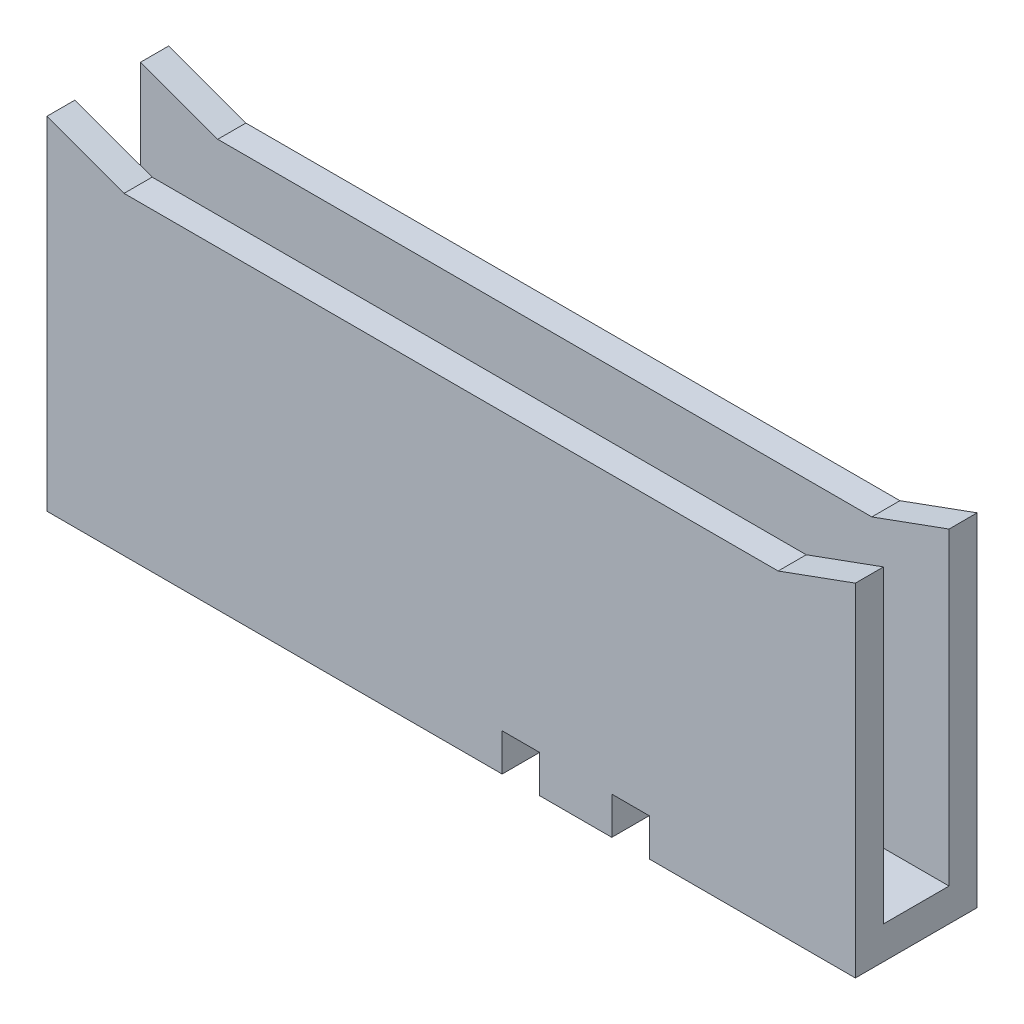
ISO-10303-21;
HEADER;
FILE_DESCRIPTION(('STEP AP214'),'2;1');
FILE_NAME('part.step','',(''),(''),'','','');
FILE_SCHEMA(('AUTOMOTIVE_DESIGN { 1 0 10303 214 1 1 1 1 }'));
ENDSEC;
DATA;
#1=APPLICATION_CONTEXT('core data for automotive mechanical design processes');
#2=APPLICATION_PROTOCOL_DEFINITION('international standard','automotive_design',2000,#1);
#3=PRODUCT_CONTEXT('',#1,'mechanical');
#4=PRODUCT('Part','Part','',(#3));
#5=PRODUCT_RELATED_PRODUCT_CATEGORY('part','',(#4));
#6=PRODUCT_DEFINITION_FORMATION('','',#4);
#7=PRODUCT_DEFINITION_CONTEXT('part definition',#1,'design');
#8=PRODUCT_DEFINITION('design','',#6,#7);
#9=PRODUCT_DEFINITION_SHAPE('','',#8);
#10=(LENGTH_UNIT() NAMED_UNIT(*) SI_UNIT(.MILLI.,.METRE.));
#11=(NAMED_UNIT(*) PLANE_ANGLE_UNIT() SI_UNIT($,.RADIAN.));
#12=(NAMED_UNIT(*) SI_UNIT($,.STERADIAN.) SOLID_ANGLE_UNIT());
#13=UNCERTAINTY_MEASURE_WITH_UNIT(LENGTH_MEASURE(1.E-05),#10,'distance_accuracy_value','');
#14=(GEOMETRIC_REPRESENTATION_CONTEXT(3) GLOBAL_UNCERTAINTY_ASSIGNED_CONTEXT((#13)) GLOBAL_UNIT_ASSIGNED_CONTEXT((#10,
#11,#12)) REPRESENTATION_CONTEXT('',''));
#15=CARTESIAN_POINT('',(0.,0.,0.));
#16=DIRECTION('',(0.,0.,1.));
#17=DIRECTION('',(1.,0.,0.));
#18=AXIS2_PLACEMENT_3D('',#15,#16,#17);
#19=CARTESIAN_POINT('',(43.15,-16.75,13.));
#20=DIRECTION('',(0.,1.,0.));
#21=DIRECTION('',(-1.,0.,0.));
#22=AXIS2_PLACEMENT_3D('',#19,#20,#21);
#23=PLANE('',#22);
#24=DIRECTION('',(1.,0.,0.));
#25=VECTOR('',#24,1.);
#26=CARTESIAN_POINT('',(43.15,-16.75,13.));
#27=LINE('',#26,#25);
#28=CARTESIAN_POINT('',(9.45,-16.75,13.));
#29=VERTEX_POINT('',#28);
#30=CARTESIAN_POINT('',(17.15,-16.75,13.));
#31=VERTEX_POINT('',#30);
#32=EDGE_CURVE('E389',#29,#31,#27,.T.);
#33=ORIENTED_EDGE('',*,*,#32,.F.);
#34=DIRECTION('',(0.,0.,1.));
#35=VECTOR('',#34,1.);
#36=CARTESIAN_POINT('',(9.45,-16.75,0.));
#37=LINE('',#36,#35);
#38=CARTESIAN_POINT('',(9.45,-16.75,0.));
#39=VERTEX_POINT('',#38);
#40=EDGE_CURVE('E253',#39,#29,#37,.T.);
#41=ORIENTED_EDGE('',*,*,#40,.F.);
#42=DIRECTION('',(1.,0.,0.));
#43=VECTOR('',#42,1.);
#44=CARTESIAN_POINT('',(43.15,-16.75,0.));
#45=LINE('',#44,#43);
#46=CARTESIAN_POINT('',(17.15,-16.75,0.));
#47=VERTEX_POINT('',#46);
#48=EDGE_CURVE('E240',#39,#47,#45,.T.);
#49=ORIENTED_EDGE('',*,*,#48,.T.);
#50=DIRECTION('',(0.,0.,1.));
#51=VECTOR('',#50,1.);
#52=CARTESIAN_POINT('',(17.15,-16.75,0.));
#53=LINE('',#52,#51);
#54=EDGE_CURVE('E267',#47,#31,#53,.T.);
#55=ORIENTED_EDGE('',*,*,#54,.T.);
#56=EDGE_LOOP('',(#33,#41,#49,#55));
#57=FACE_BOUND('',#56,.T.);
#58=ADVANCED_FACE('F32',(#57),#23,.F.);
#59=CARTESIAN_POINT('',(-38.15,-16.75,6.49999999999999));
#60=DIRECTION('',(0.,-1.,0.));
#61=DIRECTION('',(1.,0.,0.));
#62=AXIS2_PLACEMENT_3D('',#59,#60,#61);
#63=CIRCLE('',#62,0.974999999999999);
#64=CARTESIAN_POINT('',(-37.175,-16.75,6.49999999999999));
#65=VERTEX_POINT('',#64);
#66=EDGE_CURVE('E304',#65,#65,#63,.T.);
#67=ORIENTED_EDGE('',*,*,#66,.F.);
#68=EDGE_LOOP('',(#67));
#69=FACE_BOUND('',#68,.T.);
#70=CARTESIAN_POINT('',(-43.15,-16.75,0.));
#71=VERTEX_POINT('',#70);
#72=CARTESIAN_POINT('',(5.45,-16.75,0.));
#73=VERTEX_POINT('',#72);
#74=EDGE_CURVE('E398',#71,#73,#45,.T.);
#75=ORIENTED_EDGE('',*,*,#74,.T.);
#76=DIRECTION('',(0.,0.,1.));
#77=VECTOR('',#76,1.);
#78=CARTESIAN_POINT('',(5.45,-16.75,0.));
#79=LINE('',#78,#77);
#80=CARTESIAN_POINT('',(5.45,-16.75,13.));
#81=VERTEX_POINT('',#80);
#82=EDGE_CURVE('E256',#73,#81,#79,.T.);
#83=ORIENTED_EDGE('',*,*,#82,.T.);
#84=CARTESIAN_POINT('',(-43.15,-16.75,13.));
#85=VERTEX_POINT('',#84);
#86=EDGE_CURVE('E385',#85,#81,#27,.T.);
#87=ORIENTED_EDGE('',*,*,#86,.F.);
#88=DIRECTION('',(0.,0.,-1.));
#89=VECTOR('',#88,1.);
#90=CARTESIAN_POINT('',(-43.15,-16.75,13.));
#91=LINE('',#90,#89);
#92=EDGE_CURVE('E408',#85,#71,#91,.T.);
#93=ORIENTED_EDGE('',*,*,#92,.T.);
#94=EDGE_LOOP('',(#75,#83,#87,#93));
#95=FACE_BOUND('',#94,.T.);
#96=ADVANCED_FACE('F466',(#69,#95),#23,.F.);
#97=CARTESIAN_POINT('',(0.,-13.25,0.));
#98=DIRECTION('',(0.,1.,0.));
#99=DIRECTION('',(-1.,0.,0.));
#100=AXIS2_PLACEMENT_3D('',#97,#98,#99);
#101=PLANE('',#100);
#102=DIRECTION('',(0.,0.,-1.));
#103=VECTOR('',#102,1.);
#104=CARTESIAN_POINT('',(9.45,-13.25,0.));
#105=LINE('',#104,#103);
#106=CARTESIAN_POINT('',(9.45,-13.25,9.99999999999999));
#107=VERTEX_POINT('',#106);
#108=CARTESIAN_POINT('',(9.45,-13.25,3.00000000000001));
#109=VERTEX_POINT('',#108);
#110=EDGE_CURVE('E421',#107,#109,#105,.T.);
#111=ORIENTED_EDGE('',*,*,#110,.F.);
#112=DIRECTION('',(1.,0.,0.));
#113=VECTOR('',#112,1.);
#114=CARTESIAN_POINT('',(43.1499999999999,-13.25,9.99999999999999));
#115=LINE('',#114,#113);
#116=CARTESIAN_POINT('',(17.15,-13.25,9.99999999999999));
#117=VERTEX_POINT('',#116);
#118=EDGE_CURVE('E319',#107,#117,#115,.T.);
#119=ORIENTED_EDGE('',*,*,#118,.T.);
#120=DIRECTION('',(0.,0.,1.));
#121=VECTOR('',#120,1.);
#122=CARTESIAN_POINT('',(17.15,-13.25,0.));
#123=LINE('',#122,#121);
#124=CARTESIAN_POINT('',(17.15,-13.25,3.00000000000001));
#125=VERTEX_POINT('',#124);
#126=EDGE_CURVE('E417',#125,#117,#123,.T.);
#127=ORIENTED_EDGE('',*,*,#126,.F.);
#128=DIRECTION('',(-1.,0.,0.));
#129=VECTOR('',#128,1.);
#130=CARTESIAN_POINT('',(43.1499999999999,-13.25,3.00000000000001));
#131=LINE('',#130,#129);
#132=EDGE_CURVE('E327',#125,#109,#131,.T.);
#133=ORIENTED_EDGE('',*,*,#132,.T.);
#134=EDGE_LOOP('',(#111,#119,#127,#133));
#135=FACE_BOUND('',#134,.T.);
#136=ADVANCED_FACE('F534',(#135),#101,.T.);
#137=DIRECTION('',(0.,0.,1.));
#138=VECTOR('',#137,1.);
#139=CARTESIAN_POINT('',(5.45,-13.25,0.));
#140=LINE('',#139,#138);
#141=CARTESIAN_POINT('',(5.45,-13.25,3.00000000000001));
#142=VERTEX_POINT('',#141);
#143=CARTESIAN_POINT('',(5.45,-13.25,9.99999999999999));
#144=VERTEX_POINT('',#143);
#145=EDGE_CURVE('E419',#142,#144,#140,.T.);
#146=ORIENTED_EDGE('',*,*,#145,.F.);
#147=CARTESIAN_POINT('',(-43.15,-13.25,3.00000000000001));
#148=VERTEX_POINT('',#147);
#149=EDGE_CURVE('E322',#142,#148,#131,.T.);
#150=ORIENTED_EDGE('',*,*,#149,.T.);
#151=DIRECTION('',(0.,0.,1.));
#152=VECTOR('',#151,1.);
#153=CARTESIAN_POINT('',(-43.15,-13.25,9.99999999999999));
#154=LINE('',#153,#152);
#155=CARTESIAN_POINT('',(-43.15,-13.25,9.99999999999999));
#156=VERTEX_POINT('',#155);
#157=EDGE_CURVE('E310',#148,#156,#154,.T.);
#158=ORIENTED_EDGE('',*,*,#157,.T.);
#159=EDGE_CURVE('E315',#156,#144,#115,.T.);
#160=ORIENTED_EDGE('',*,*,#159,.T.);
#161=EDGE_LOOP('',(#146,#150,#158,#160));
#162=FACE_BOUND('',#161,.T.);
#163=CARTESIAN_POINT('',(-38.15,-13.25,6.49999999999999));
#164=DIRECTION('',(0.,1.,0.));
#165=DIRECTION('',(-1.,0.,0.));
#166=AXIS2_PLACEMENT_3D('',#163,#164,#165);
#167=CIRCLE('',#166,0.974999999999999);
#168=CARTESIAN_POINT('',(-39.125,-13.25,6.49999999999999));
#169=VERTEX_POINT('',#168);
#170=EDGE_CURVE('E330',#169,#169,#167,.T.);
#171=ORIENTED_EDGE('',*,*,#170,.F.);
#172=EDGE_LOOP('',(#171));
#173=FACE_BOUND('',#172,.T.);
#174=ADVANCED_FACE('F439',(#162,#173),#101,.T.);
#175=CARTESIAN_POINT('',(43.15,16.75,13.));
#176=DIRECTION('',(0.,-1.,0.));
#177=DIRECTION('',(1.,0.,0.));
#178=AXIS2_PLACEMENT_3D('',#175,#176,#177);
#179=PLANE('',#178);
#180=DIRECTION('',(0.,0.,-1.));
#181=VECTOR('',#180,1.);
#182=CARTESIAN_POINT('',(-34.9075677416363,16.75,13.));
#183=LINE('',#182,#181);
#184=CARTESIAN_POINT('',(-34.9075677416363,16.75,3.00000000000001));
#185=VERTEX_POINT('',#184);
#186=CARTESIAN_POINT('',(-34.9075677416363,16.75,0.));
#187=VERTEX_POINT('',#186);
#188=EDGE_CURVE('E362',#185,#187,#183,.T.);
#189=ORIENTED_EDGE('',*,*,#188,.F.);
#190=DIRECTION('',(-1.,0.,0.));
#191=VECTOR('',#190,1.);
#192=CARTESIAN_POINT('',(43.1499999999999,16.75,3.00000000000001));
#193=LINE('',#192,#191);
#194=CARTESIAN_POINT('',(34.9075677416361,16.75,3.00000000000001));
#195=VERTEX_POINT('',#194);
#196=EDGE_CURVE('E314',#195,#185,#193,.T.);
#197=ORIENTED_EDGE('',*,*,#196,.F.);
#198=DIRECTION('',(0.,0.,-1.));
#199=VECTOR('',#198,1.);
#200=CARTESIAN_POINT('',(34.9075677416361,16.75,13.));
#201=LINE('',#200,#199);
#202=CARTESIAN_POINT('',(34.9075677416361,16.75,0.));
#203=VERTEX_POINT('',#202);
#204=EDGE_CURVE('E369',#195,#203,#201,.T.);
#205=ORIENTED_EDGE('',*,*,#204,.T.);
#206=DIRECTION('',(-1.,0.,0.));
#207=VECTOR('',#206,1.);
#208=CARTESIAN_POINT('',(43.15,16.75,0.));
#209=LINE('',#208,#207);
#210=EDGE_CURVE('E384',#203,#187,#209,.T.);
#211=ORIENTED_EDGE('',*,*,#210,.T.);
#212=EDGE_LOOP('',(#189,#197,#205,#211));
#213=FACE_BOUND('',#212,.T.);
#214=ADVANCED_FACE('F475',(#213),#179,.F.);
#215=CARTESIAN_POINT('',(-43.15,-16.75,13.));
#216=DIRECTION('',(1.,0.,0.));
#217=DIRECTION('',(0.,0.,-1.));
#218=AXIS2_PLACEMENT_3D('',#215,#216,#217);
#219=PLANE('',#218);
#220=ORIENTED_EDGE('',*,*,#157,.F.);
#221=DIRECTION('',(0.,-1.,0.));
#222=VECTOR('',#221,1.);
#223=CARTESIAN_POINT('',(-43.15,19.751,3.00000000000001));
#224=LINE('',#223,#222);
#225=CARTESIAN_POINT('',(-43.15,19.75,3.00000000000001));
#226=VERTEX_POINT('',#225);
#227=EDGE_CURVE('E340',#226,#148,#224,.T.);
#228=ORIENTED_EDGE('',*,*,#227,.F.);
#229=DIRECTION('',(0.,0.,-1.));
#230=VECTOR('',#229,1.);
#231=CARTESIAN_POINT('',(-43.15,19.75,13.));
#232=LINE('',#231,#230);
#233=CARTESIAN_POINT('',(-43.15,19.75,0.));
#234=VERTEX_POINT('',#233);
#235=EDGE_CURVE('E355',#226,#234,#232,.T.);
#236=ORIENTED_EDGE('',*,*,#235,.T.);
#237=DIRECTION('',(0.,-1.,0.));
#238=VECTOR('',#237,1.);
#239=CARTESIAN_POINT('',(-43.15,-16.75,0.));
#240=LINE('',#239,#238);
#241=EDGE_CURVE('E375',#234,#71,#240,.T.);
#242=ORIENTED_EDGE('',*,*,#241,.T.);
#243=ORIENTED_EDGE('',*,*,#92,.F.);
#244=DIRECTION('',(0.,-1.,0.));
#245=VECTOR('',#244,1.);
#246=CARTESIAN_POINT('',(-43.15,-16.75,13.));
#247=LINE('',#246,#245);
#248=CARTESIAN_POINT('',(-43.15,19.75,13.));
#249=VERTEX_POINT('',#248);
#250=EDGE_CURVE('E380',#249,#85,#247,.T.);
#251=ORIENTED_EDGE('',*,*,#250,.F.);
#252=CARTESIAN_POINT('',(-43.15,19.75,10.));
#253=VERTEX_POINT('',#252);
#254=EDGE_CURVE('E363',#249,#253,#232,.T.);
#255=ORIENTED_EDGE('',*,*,#254,.T.);
#256=DIRECTION('',(0.,-1.,0.));
#257=VECTOR('',#256,1.);
#258=CARTESIAN_POINT('',(-43.15,19.751,10.));
#259=LINE('',#258,#257);
#260=EDGE_CURVE('E338',#253,#156,#259,.T.);
#261=ORIENTED_EDGE('',*,*,#260,.T.);
#262=EDGE_LOOP('',(#220,#228,#236,#242,#243,#251,#255,#261));
#263=FACE_BOUND('',#262,.T.);
#264=ADVANCED_FACE('F34',(#263),#219,.F.);
#265=CARTESIAN_POINT('',(43.15,-16.75,13.));
#266=DIRECTION('',(-1.,0.,0.));
#267=DIRECTION('',(0.,0.,1.));
#268=AXIS2_PLACEMENT_3D('',#265,#266,#267);
#269=PLANE('',#268);
#270=DIRECTION('',(0.,-1.,0.));
#271=VECTOR('',#270,1.);
#272=CARTESIAN_POINT('',(43.15,19.751,3.00000000000001));
#273=LINE('',#272,#271);
#274=CARTESIAN_POINT('',(43.15,19.75,3.00000000000001));
#275=VERTEX_POINT('',#274);
#276=CARTESIAN_POINT('',(43.1499999999999,-13.25,3.00000000000001));
#277=VERTEX_POINT('',#276);
#278=EDGE_CURVE('E326',#275,#277,#273,.T.);
#279=ORIENTED_EDGE('',*,*,#278,.T.);
#280=DIRECTION('',(0.,0.,-1.));
#281=VECTOR('',#280,1.);
#282=CARTESIAN_POINT('',(43.1499999999999,-13.25,9.99999999999999));
#283=LINE('',#282,#281);
#284=CARTESIAN_POINT('',(43.1499999999999,-13.25,9.99999999999999));
#285=VERTEX_POINT('',#284);
#286=EDGE_CURVE('E318',#285,#277,#283,.T.);
#287=ORIENTED_EDGE('',*,*,#286,.F.);
#288=DIRECTION('',(0.,-1.,0.));
#289=VECTOR('',#288,1.);
#290=CARTESIAN_POINT('',(43.15,19.751,10.));
#291=LINE('',#290,#289);
#292=CARTESIAN_POINT('',(43.15,19.75,10.));
#293=VERTEX_POINT('',#292);
#294=EDGE_CURVE('E345',#293,#285,#291,.T.);
#295=ORIENTED_EDGE('',*,*,#294,.F.);
#296=DIRECTION('',(0.,0.,-1.));
#297=VECTOR('',#296,1.);
#298=CARTESIAN_POINT('',(43.15,19.75,13.));
#299=LINE('',#298,#297);
#300=CARTESIAN_POINT('',(43.15,19.75,13.));
#301=VERTEX_POINT('',#300);
#302=EDGE_CURVE('E372',#301,#293,#299,.T.);
#303=ORIENTED_EDGE('',*,*,#302,.F.);
#304=DIRECTION('',(0.,1.,0.));
#305=VECTOR('',#304,1.);
#306=CARTESIAN_POINT('',(43.15,-16.75,13.));
#307=LINE('',#306,#305);
#308=CARTESIAN_POINT('',(43.15,-16.75,13.));
#309=VERTEX_POINT('',#308);
#310=EDGE_CURVE('E388',#309,#301,#307,.T.);
#311=ORIENTED_EDGE('',*,*,#310,.F.);
#312=DIRECTION('',(0.,0.,-1.));
#313=VECTOR('',#312,1.);
#314=CARTESIAN_POINT('',(43.15,-16.75,13.));
#315=LINE('',#314,#313);
#316=CARTESIAN_POINT('',(43.15,-16.75,0.));
#317=VERTEX_POINT('',#316);
#318=EDGE_CURVE('E394',#309,#317,#315,.T.);
#319=ORIENTED_EDGE('',*,*,#318,.T.);
#320=DIRECTION('',(0.,1.,0.));
#321=VECTOR('',#320,1.);
#322=CARTESIAN_POINT('',(43.15,-16.75,0.));
#323=LINE('',#322,#321);
#324=CARTESIAN_POINT('',(43.15,19.75,0.));
#325=VERTEX_POINT('',#324);
#326=EDGE_CURVE('E401',#317,#325,#323,.T.);
#327=ORIENTED_EDGE('',*,*,#326,.T.);
#328=EDGE_CURVE('E376',#275,#325,#299,.T.);
#329=ORIENTED_EDGE('',*,*,#328,.F.);
#330=EDGE_LOOP('',(#279,#287,#295,#303,#311,#319,#327,#329));
#331=FACE_BOUND('',#330,.T.);
#332=ADVANCED_FACE('F485',(#331),#269,.F.);
#333=CARTESIAN_POINT('',(34.9075677416361,16.75,13.));
#334=DIRECTION('',(-0.342020143325665,0.93969262078591,0.));
#335=DIRECTION('',(-0.93969262078591,-0.342020143325665,0.));
#336=AXIS2_PLACEMENT_3D('',#333,#334,#335);
#337=PLANE('',#336);
#338=ORIENTED_EDGE('',*,*,#204,.F.);
#339=DIRECTION('',(-0.93969262078591,-0.342020143325665,0.));
#340=VECTOR('',#339,1.);
#341=CARTESIAN_POINT('',(-33.0544963267793,-7.98616838019552,3.00000000000001));
#342=LINE('',#341,#340);
#343=EDGE_CURVE('E348',#275,#195,#342,.T.);
#344=ORIENTED_EDGE('',*,*,#343,.F.);
#345=ORIENTED_EDGE('',*,*,#328,.T.);
#346=DIRECTION('',(0.93969262078591,0.342020143325665,0.));
#347=VECTOR('',#346,1.);
#348=CARTESIAN_POINT('',(34.9075677416361,16.75,0.));
#349=LINE('',#348,#347);
#350=EDGE_CURVE('E361',#203,#325,#349,.T.);
#351=ORIENTED_EDGE('',*,*,#350,.F.);
#352=EDGE_LOOP('',(#338,#344,#345,#351));
#353=FACE_BOUND('',#352,.T.);
#354=ADVANCED_FACE('F481',(#353),#337,.T.);
#355=ORIENTED_EDGE('',*,*,#302,.T.);
#356=DIRECTION('',(0.93969262078591,0.342020143325665,0.));
#357=VECTOR('',#356,1.);
#358=CARTESIAN_POINT('',(-33.0544963267793,-7.98616838019552,10.));
#359=LINE('',#358,#357);
#360=CARTESIAN_POINT('',(34.9075677416361,16.75,10.));
#361=VERTEX_POINT('',#360);
#362=EDGE_CURVE('E336',#361,#293,#359,.T.);
#363=ORIENTED_EDGE('',*,*,#362,.F.);
#364=CARTESIAN_POINT('',(34.9075677416361,16.75,13.));
#365=VERTEX_POINT('',#364);
#366=EDGE_CURVE('E377',#365,#361,#201,.T.);
#367=ORIENTED_EDGE('',*,*,#366,.F.);
#368=DIRECTION('',(0.93969262078591,0.342020143325665,0.));
#369=VECTOR('',#368,1.);
#370=CARTESIAN_POINT('',(34.9075677416361,16.75,13.));
#371=LINE('',#370,#369);
#372=EDGE_CURVE('E366',#365,#301,#371,.T.);
#373=ORIENTED_EDGE('',*,*,#372,.T.);
#374=EDGE_LOOP('',(#355,#363,#367,#373));
#375=FACE_BOUND('',#374,.T.);
#376=ADVANCED_FACE('F514',(#375),#337,.T.);
#377=CARTESIAN_POINT('',(-43.15,19.75,13.));
#378=DIRECTION('',(0.342020143325673,0.939692620785907,0.));
#379=DIRECTION('',(-0.939692620785907,0.342020143325673,0.));
#380=AXIS2_PLACEMENT_3D('',#377,#378,#379);
#381=PLANE('',#380);
#382=CARTESIAN_POINT('',(-34.9075677416363,16.75,13.));
#383=VERTEX_POINT('',#382);
#384=CARTESIAN_POINT('',(-34.9075677416363,16.75,9.99999999999999));
#385=VERTEX_POINT('',#384);
#386=EDGE_CURVE('E358',#383,#385,#183,.T.);
#387=ORIENTED_EDGE('',*,*,#386,.T.);
#388=DIRECTION('',(0.939692620785907,-0.342020143325673,0.));
#389=VECTOR('',#388,1.);
#390=CARTESIAN_POINT('',(-43.1503213938049,19.7501169777784,10.));
#391=LINE('',#390,#389);
#392=EDGE_CURVE('E332',#253,#385,#391,.T.);
#393=ORIENTED_EDGE('',*,*,#392,.F.);
#394=ORIENTED_EDGE('',*,*,#254,.F.);
#395=DIRECTION('',(0.939692620785907,-0.342020143325673,0.));
#396=VECTOR('',#395,1.);
#397=CARTESIAN_POINT('',(-43.15,19.75,13.));
#398=LINE('',#397,#396);
#399=EDGE_CURVE('E352',#249,#383,#398,.T.);
#400=ORIENTED_EDGE('',*,*,#399,.T.);
#401=EDGE_LOOP('',(#387,#393,#394,#400));
#402=FACE_BOUND('',#401,.T.);
#403=ADVANCED_FACE('F520',(#402),#381,.T.);
#404=ORIENTED_EDGE('',*,*,#235,.F.);
#405=DIRECTION('',(-0.939692620785907,0.342020143325673,0.));
#406=VECTOR('',#405,1.);
#407=CARTESIAN_POINT('',(-43.1503213938049,19.7501169777784,3.00000000000001));
#408=LINE('',#407,#406);
#409=EDGE_CURVE('E335',#185,#226,#408,.T.);
#410=ORIENTED_EDGE('',*,*,#409,.F.);
#411=ORIENTED_EDGE('',*,*,#188,.T.);
#412=DIRECTION('',(0.939692620785907,-0.342020143325673,0.));
#413=VECTOR('',#412,1.);
#414=CARTESIAN_POINT('',(-43.15,19.75,0.));
#415=LINE('',#414,#413);
#416=EDGE_CURVE('E343',#234,#187,#415,.T.);
#417=ORIENTED_EDGE('',*,*,#416,.F.);
#418=EDGE_LOOP('',(#404,#410,#411,#417));
#419=FACE_BOUND('',#418,.T.);
#420=ADVANCED_FACE('F472',(#419),#381,.T.);
#421=CARTESIAN_POINT('',(38.15,-16.75,6.5));
#422=DIRECTION('',(0.,-1.,0.));
#423=DIRECTION('',(1.,0.,0.));
#424=AXIS2_PLACEMENT_3D('',#421,#422,#423);
#425=CIRCLE('',#424,0.974999999999999);
#426=CARTESIAN_POINT('',(39.125,-16.75,6.5));
#427=VERTEX_POINT('',#426);
#428=EDGE_CURVE('E303',#427,#427,#425,.T.);
#429=ORIENTED_EDGE('',*,*,#428,.F.);
#430=EDGE_LOOP('',(#429));
#431=FACE_BOUND('',#430,.T.);
#432=CARTESIAN_POINT('',(21.15,-16.75,13.));
#433=VERTEX_POINT('',#432);
#434=EDGE_CURVE('E383',#433,#309,#27,.T.);
#435=ORIENTED_EDGE('',*,*,#434,.F.);
#436=DIRECTION('',(0.,0.,1.));
#437=VECTOR('',#436,1.);
#438=CARTESIAN_POINT('',(21.15,-16.75,0.));
#439=LINE('',#438,#437);
#440=CARTESIAN_POINT('',(21.15,-16.75,0.));
#441=VERTEX_POINT('',#440);
#442=EDGE_CURVE('E281',#441,#433,#439,.T.);
#443=ORIENTED_EDGE('',*,*,#442,.F.);
#444=EDGE_CURVE('E397',#441,#317,#45,.T.);
#445=ORIENTED_EDGE('',*,*,#444,.T.);
#446=ORIENTED_EDGE('',*,*,#318,.F.);
#447=EDGE_LOOP('',(#435,#443,#445,#446));
#448=FACE_BOUND('',#447,.T.);
#449=ADVANCED_FACE('F491',(#431,#448),#23,.F.);
#450=ORIENTED_EDGE('',*,*,#366,.T.);
#451=DIRECTION('',(1.,0.,0.));
#452=VECTOR('',#451,1.);
#453=CARTESIAN_POINT('',(43.1499999999999,16.75,9.99999999999999));
#454=LINE('',#453,#452);
#455=EDGE_CURVE('E328',#385,#361,#454,.T.);
#456=ORIENTED_EDGE('',*,*,#455,.F.);
#457=ORIENTED_EDGE('',*,*,#386,.F.);
#458=DIRECTION('',(-1.,0.,0.));
#459=VECTOR('',#458,1.);
#460=CARTESIAN_POINT('',(43.15,16.75,13.));
#461=LINE('',#460,#459);
#462=EDGE_CURVE('E391',#365,#383,#461,.T.);
#463=ORIENTED_EDGE('',*,*,#462,.F.);
#464=EDGE_LOOP('',(#450,#456,#457,#463));
#465=FACE_BOUND('',#464,.T.);
#466=ADVANCED_FACE('F518',(#465),#179,.F.);
#467=CARTESIAN_POINT('',(0.,0.,13.));
#468=DIRECTION('',(0.,0.,1.));
#469=DIRECTION('',(1.,0.,0.));
#470=AXIS2_PLACEMENT_3D('',#467,#468,#469);
#471=PLANE('',#470);
#472=DIRECTION('',(0.,1.,0.));
#473=VECTOR('',#472,1.);
#474=CARTESIAN_POINT('',(9.45,-12.75,13.));
#475=LINE('',#474,#473);
#476=CARTESIAN_POINT('',(9.45,-12.75,13.));
#477=VERTEX_POINT('',#476);
#478=EDGE_CURVE('E247',#29,#477,#475,.T.);
#479=ORIENTED_EDGE('',*,*,#478,.F.);
#480=ORIENTED_EDGE('',*,*,#32,.T.);
#481=DIRECTION('',(0.,-1.,0.));
#482=VECTOR('',#481,1.);
#483=CARTESIAN_POINT('',(17.15,-12.75,13.));
#484=LINE('',#483,#482);
#485=CARTESIAN_POINT('',(17.15,-12.75,13.));
#486=VERTEX_POINT('',#485);
#487=EDGE_CURVE('E268',#486,#31,#484,.T.);
#488=ORIENTED_EDGE('',*,*,#487,.F.);
#489=DIRECTION('',(-1.,0.,0.));
#490=VECTOR('',#489,1.);
#491=CARTESIAN_POINT('',(21.15,-12.75,13.));
#492=LINE('',#491,#490);
#493=CARTESIAN_POINT('',(21.15,-12.75,13.));
#494=VERTEX_POINT('',#493);
#495=EDGE_CURVE('E263',#494,#486,#492,.T.);
#496=ORIENTED_EDGE('',*,*,#495,.F.);
#497=DIRECTION('',(0.,1.,0.));
#498=VECTOR('',#497,1.);
#499=CARTESIAN_POINT('',(21.15,-12.75,13.));
#500=LINE('',#499,#498);
#501=EDGE_CURVE('E270',#433,#494,#500,.T.);
#502=ORIENTED_EDGE('',*,*,#501,.F.);
#503=ORIENTED_EDGE('',*,*,#434,.T.);
#504=ORIENTED_EDGE('',*,*,#310,.T.);
#505=ORIENTED_EDGE('',*,*,#372,.F.);
#506=ORIENTED_EDGE('',*,*,#462,.T.);
#507=ORIENTED_EDGE('',*,*,#399,.F.);
#508=ORIENTED_EDGE('',*,*,#250,.T.);
#509=ORIENTED_EDGE('',*,*,#86,.T.);
#510=DIRECTION('',(0.,-1.,0.));
#511=VECTOR('',#510,1.);
#512=CARTESIAN_POINT('',(5.45,-12.75,13.));
#513=LINE('',#512,#511);
#514=CARTESIAN_POINT('',(5.45,-12.75,13.));
#515=VERTEX_POINT('',#514);
#516=EDGE_CURVE('E241',#515,#81,#513,.T.);
#517=ORIENTED_EDGE('',*,*,#516,.F.);
#518=DIRECTION('',(-1.,0.,0.));
#519=VECTOR('',#518,1.);
#520=CARTESIAN_POINT('',(5.45,-12.75,13.));
#521=LINE('',#520,#519);
#522=EDGE_CURVE('E243',#477,#515,#521,.T.);
#523=ORIENTED_EDGE('',*,*,#522,.F.);
#524=EDGE_LOOP('',(#479,#480,#488,#496,#502,#503,#504,#505,#506,#507,#508,#509,#517,#523));
#525=FACE_BOUND('',#524,.T.);
#526=ADVANCED_FACE('F464',(#525),#471,.T.);
#527=CARTESIAN_POINT('',(0.,0.,0.));
#528=DIRECTION('',(0.,0.,1.));
#529=DIRECTION('',(1.,0.,0.));
#530=AXIS2_PLACEMENT_3D('',#527,#528,#529);
#531=PLANE('',#530);
#532=ORIENTED_EDGE('',*,*,#48,.F.);
#533=DIRECTION('',(0.,1.,0.));
#534=VECTOR('',#533,1.);
#535=CARTESIAN_POINT('',(9.45,-12.75,0.));
#536=LINE('',#535,#534);
#537=CARTESIAN_POINT('',(9.45,-12.75,0.));
#538=VERTEX_POINT('',#537);
#539=EDGE_CURVE('E221',#39,#538,#536,.T.);
#540=ORIENTED_EDGE('',*,*,#539,.T.);
#541=DIRECTION('',(-1.,0.,0.));
#542=VECTOR('',#541,1.);
#543=CARTESIAN_POINT('',(5.45,-12.75,0.));
#544=LINE('',#543,#542);
#545=CARTESIAN_POINT('',(5.45,-12.75,0.));
#546=VERTEX_POINT('',#545);
#547=EDGE_CURVE('E231',#538,#546,#544,.T.);
#548=ORIENTED_EDGE('',*,*,#547,.T.);
#549=DIRECTION('',(0.,-1.,0.));
#550=VECTOR('',#549,1.);
#551=CARTESIAN_POINT('',(5.45,-12.75,0.));
#552=LINE('',#551,#550);
#553=EDGE_CURVE('E47',#546,#73,#552,.T.);
#554=ORIENTED_EDGE('',*,*,#553,.T.);
#555=ORIENTED_EDGE('',*,*,#74,.F.);
#556=ORIENTED_EDGE('',*,*,#241,.F.);
#557=ORIENTED_EDGE('',*,*,#416,.T.);
#558=ORIENTED_EDGE('',*,*,#210,.F.);
#559=ORIENTED_EDGE('',*,*,#350,.T.);
#560=ORIENTED_EDGE('',*,*,#326,.F.);
#561=ORIENTED_EDGE('',*,*,#444,.F.);
#562=DIRECTION('',(0.,1.,0.));
#563=VECTOR('',#562,1.);
#564=CARTESIAN_POINT('',(21.15,-12.75,0.));
#565=LINE('',#564,#563);
#566=CARTESIAN_POINT('',(21.15,-12.75,0.));
#567=VERTEX_POINT('',#566);
#568=EDGE_CURVE('E262',#441,#567,#565,.T.);
#569=ORIENTED_EDGE('',*,*,#568,.T.);
#570=DIRECTION('',(-1.,0.,0.));
#571=VECTOR('',#570,1.);
#572=CARTESIAN_POINT('',(21.15,-12.75,0.));
#573=LINE('',#572,#571);
#574=CARTESIAN_POINT('',(17.15,-12.75,0.));
#575=VERTEX_POINT('',#574);
#576=EDGE_CURVE('E55',#567,#575,#573,.T.);
#577=ORIENTED_EDGE('',*,*,#576,.T.);
#578=DIRECTION('',(0.,-1.,0.));
#579=VECTOR('',#578,1.);
#580=CARTESIAN_POINT('',(17.15,-12.75,0.));
#581=LINE('',#580,#579);
#582=EDGE_CURVE('E260',#575,#47,#581,.T.);
#583=ORIENTED_EDGE('',*,*,#582,.T.);
#584=EDGE_LOOP('',(#532,#540,#548,#554,#555,#556,#557,#558,#559,#560,#561,#569,#577,#583));
#585=FACE_BOUND('',#584,.T.);
#586=ADVANCED_FACE('F237',(#585),#531,.F.);
#587=CARTESIAN_POINT('',(-43.15,19.751,10.));
#588=DIRECTION('',(0.,0.,-1.));
#589=DIRECTION('',(-1.,0.,0.));
#590=AXIS2_PLACEMENT_3D('',#587,#588,#589);
#591=PLANE('',#590);
#592=DIRECTION('',(0.,-1.,0.));
#593=VECTOR('',#592,1.);
#594=CARTESIAN_POINT('',(9.45,19.751,10.));
#595=LINE('',#594,#593);
#596=CARTESIAN_POINT('',(9.45,-12.75,10.));
#597=VERTEX_POINT('',#596);
#598=EDGE_CURVE('E297',#597,#107,#595,.T.);
#599=ORIENTED_EDGE('',*,*,#598,.F.);
#600=DIRECTION('',(1.,0.,0.));
#601=VECTOR('',#600,1.);
#602=CARTESIAN_POINT('',(-43.15,-12.75,10.));
#603=LINE('',#602,#601);
#604=CARTESIAN_POINT('',(5.45,-12.75,10.));
#605=VERTEX_POINT('',#604);
#606=EDGE_CURVE('E301',#605,#597,#603,.T.);
#607=ORIENTED_EDGE('',*,*,#606,.F.);
#608=DIRECTION('',(0.,1.,0.));
#609=VECTOR('',#608,1.);
#610=CARTESIAN_POINT('',(5.45,19.751,10.));
#611=LINE('',#610,#609);
#612=EDGE_CURVE('E294',#144,#605,#611,.T.);
#613=ORIENTED_EDGE('',*,*,#612,.F.);
#614=ORIENTED_EDGE('',*,*,#159,.F.);
#615=ORIENTED_EDGE('',*,*,#260,.F.);
#616=ORIENTED_EDGE('',*,*,#392,.T.);
#617=ORIENTED_EDGE('',*,*,#455,.T.);
#618=ORIENTED_EDGE('',*,*,#362,.T.);
#619=ORIENTED_EDGE('',*,*,#294,.T.);
#620=CARTESIAN_POINT('',(21.15,-13.25,9.99999999999999));
#621=VERTEX_POINT('',#620);
#622=EDGE_CURVE('E313',#621,#285,#115,.T.);
#623=ORIENTED_EDGE('',*,*,#622,.F.);
#624=DIRECTION('',(0.,-1.,0.));
#625=VECTOR('',#624,1.);
#626=CARTESIAN_POINT('',(21.15,19.7509999999999,10.));
#627=LINE('',#626,#625);
#628=CARTESIAN_POINT('',(21.15,-12.75,10.));
#629=VERTEX_POINT('',#628);
#630=EDGE_CURVE('E286',#629,#621,#627,.T.);
#631=ORIENTED_EDGE('',*,*,#630,.F.);
#632=DIRECTION('',(1.,0.,0.));
#633=VECTOR('',#632,1.);
#634=CARTESIAN_POINT('',(-43.15,-12.75,10.));
#635=LINE('',#634,#633);
#636=CARTESIAN_POINT('',(17.15,-12.75,10.));
#637=VERTEX_POINT('',#636);
#638=EDGE_CURVE('E299',#637,#629,#635,.T.);
#639=ORIENTED_EDGE('',*,*,#638,.F.);
#640=DIRECTION('',(0.,1.,0.));
#641=VECTOR('',#640,1.);
#642=CARTESIAN_POINT('',(17.15,19.751,10.));
#643=LINE('',#642,#641);
#644=EDGE_CURVE('E290',#117,#637,#643,.T.);
#645=ORIENTED_EDGE('',*,*,#644,.F.);
#646=ORIENTED_EDGE('',*,*,#118,.F.);
#647=EDGE_LOOP('',(#599,#607,#613,#614,#615,#616,#617,#618,#619,#623,#631,#639,#645,#646));
#648=FACE_BOUND('',#647,.T.);
#649=ADVANCED_FACE('F453',(#648),#591,.T.);
#650=CARTESIAN_POINT('',(-43.15,19.751,3.00000000000001));
#651=DIRECTION('',(0.,0.,1.));
#652=DIRECTION('',(1.,0.,0.));
#653=AXIS2_PLACEMENT_3D('',#650,#651,#652);
#654=PLANE('',#653);
#655=DIRECTION('',(0.,1.,0.));
#656=VECTOR('',#655,1.);
#657=CARTESIAN_POINT('',(9.45,19.751,3.00000000000001));
#658=LINE('',#657,#656);
#659=CARTESIAN_POINT('',(9.45,-12.75,3.00000000000001));
#660=VERTEX_POINT('',#659);
#661=EDGE_CURVE('E224',#109,#660,#658,.T.);
#662=ORIENTED_EDGE('',*,*,#661,.F.);
#663=ORIENTED_EDGE('',*,*,#132,.F.);
#664=DIRECTION('',(0.,-1.,0.));
#665=VECTOR('',#664,1.);
#666=CARTESIAN_POINT('',(17.15,19.751,3.00000000000001));
#667=LINE('',#666,#665);
#668=CARTESIAN_POINT('',(17.15,-12.75,3.00000000000001));
#669=VERTEX_POINT('',#668);
#670=EDGE_CURVE('E288',#669,#125,#667,.T.);
#671=ORIENTED_EDGE('',*,*,#670,.F.);
#672=DIRECTION('',(-1.,0.,0.));
#673=VECTOR('',#672,1.);
#674=CARTESIAN_POINT('',(-43.15,-12.75,3.00000000000001));
#675=LINE('',#674,#673);
#676=CARTESIAN_POINT('',(21.15,-12.75,3.00000000000001));
#677=VERTEX_POINT('',#676);
#678=EDGE_CURVE('E40',#677,#669,#675,.T.);
#679=ORIENTED_EDGE('',*,*,#678,.F.);
#680=DIRECTION('',(0.,1.,0.));
#681=VECTOR('',#680,1.);
#682=CARTESIAN_POINT('',(21.15,19.7509999999999,3.00000000000001));
#683=LINE('',#682,#681);
#684=CARTESIAN_POINT('',(21.15,-13.25,3.00000000000001));
#685=VERTEX_POINT('',#684);
#686=EDGE_CURVE('E255',#685,#677,#683,.T.);
#687=ORIENTED_EDGE('',*,*,#686,.F.);
#688=EDGE_CURVE('E323',#277,#685,#131,.T.);
#689=ORIENTED_EDGE('',*,*,#688,.F.);
#690=ORIENTED_EDGE('',*,*,#278,.F.);
#691=ORIENTED_EDGE('',*,*,#343,.T.);
#692=ORIENTED_EDGE('',*,*,#196,.T.);
#693=ORIENTED_EDGE('',*,*,#409,.T.);
#694=ORIENTED_EDGE('',*,*,#227,.T.);
#695=ORIENTED_EDGE('',*,*,#149,.F.);
#696=DIRECTION('',(0.,-1.,0.));
#697=VECTOR('',#696,1.);
#698=CARTESIAN_POINT('',(5.45,19.751,3.00000000000001));
#699=LINE('',#698,#697);
#700=CARTESIAN_POINT('',(5.45,-12.75,3.00000000000001));
#701=VERTEX_POINT('',#700);
#702=EDGE_CURVE('E292',#701,#142,#699,.T.);
#703=ORIENTED_EDGE('',*,*,#702,.F.);
#704=DIRECTION('',(-1.,0.,0.));
#705=VECTOR('',#704,1.);
#706=CARTESIAN_POINT('',(-43.15,-12.75,3.00000000000001));
#707=LINE('',#706,#705);
#708=EDGE_CURVE('E11',#660,#701,#707,.T.);
#709=ORIENTED_EDGE('',*,*,#708,.F.);
#710=EDGE_LOOP('',(#662,#663,#671,#679,#687,#689,#690,#691,#692,#693,#694,#695,#703,#709));
#711=FACE_BOUND('',#710,.T.);
#712=ADVANCED_FACE('F432',(#711),#654,.T.);
#713=DIRECTION('',(0.,0.,-1.));
#714=VECTOR('',#713,1.);
#715=CARTESIAN_POINT('',(21.15,-13.25,0.));
#716=LINE('',#715,#714);
#717=EDGE_CURVE('E411',#621,#685,#716,.T.);
#718=ORIENTED_EDGE('',*,*,#717,.F.);
#719=ORIENTED_EDGE('',*,*,#622,.T.);
#720=ORIENTED_EDGE('',*,*,#286,.T.);
#721=ORIENTED_EDGE('',*,*,#688,.T.);
#722=EDGE_LOOP('',(#718,#719,#720,#721));
#723=FACE_BOUND('',#722,.T.);
#724=CARTESIAN_POINT('',(38.15,-13.25,6.5));
#725=DIRECTION('',(0.,1.,0.));
#726=DIRECTION('',(-1.,0.,0.));
#727=AXIS2_PLACEMENT_3D('',#724,#725,#726);
#728=CIRCLE('',#727,0.974999999999999);
#729=CARTESIAN_POINT('',(37.175,-13.25,6.5));
#730=VERTEX_POINT('',#729);
#731=EDGE_CURVE('E307',#730,#730,#728,.T.);
#732=ORIENTED_EDGE('',*,*,#731,.F.);
#733=EDGE_LOOP('',(#732));
#734=FACE_BOUND('',#733,.T.);
#735=ADVANCED_FACE('F507',(#723,#734),#101,.T.);
#736=CARTESIAN_POINT('',(38.15,19.75,6.5));
#737=DIRECTION('',(0.,-1.,0.));
#738=DIRECTION('',(1.,0.,0.));
#739=AXIS2_PLACEMENT_3D('',#736,#737,#738);
#740=CYLINDRICAL_SURFACE('',#739,0.974999999999999);
#741=ORIENTED_EDGE('',*,*,#731,.T.);
#742=EDGE_LOOP('',(#741));
#743=FACE_BOUND('',#742,.T.);
#744=ORIENTED_EDGE('',*,*,#428,.T.);
#745=EDGE_LOOP('',(#744));
#746=FACE_BOUND('',#745,.T.);
#747=ADVANCED_FACE('F547',(#743,#746),#740,.F.);
#748=CARTESIAN_POINT('',(-38.15,19.75,6.49999999999999));
#749=DIRECTION('',(0.,-1.,0.));
#750=DIRECTION('',(1.,0.,0.));
#751=AXIS2_PLACEMENT_3D('',#748,#749,#750);
#752=CYLINDRICAL_SURFACE('',#751,0.974999999999999);
#753=ORIENTED_EDGE('',*,*,#170,.T.);
#754=EDGE_LOOP('',(#753));
#755=FACE_BOUND('',#754,.T.);
#756=ORIENTED_EDGE('',*,*,#66,.T.);
#757=EDGE_LOOP('',(#756));
#758=FACE_BOUND('',#757,.T.);
#759=ADVANCED_FACE('F549',(#755,#758),#752,.F.);
#760=CARTESIAN_POINT('',(21.15,-12.75,0.));
#761=DIRECTION('',(0.,1.,0.));
#762=DIRECTION('',(-1.,0.,0.));
#763=AXIS2_PLACEMENT_3D('',#760,#761,#762);
#764=PLANE('',#763);
#765=ORIENTED_EDGE('',*,*,#638,.T.);
#766=DIRECTION('',(0.,0.,1.));
#767=VECTOR('',#766,1.);
#768=CARTESIAN_POINT('',(21.15,-12.75,0.));
#769=LINE('',#768,#767);
#770=EDGE_CURVE('E280',#629,#494,#769,.T.);
#771=ORIENTED_EDGE('',*,*,#770,.T.);
#772=ORIENTED_EDGE('',*,*,#495,.T.);
#773=DIRECTION('',(0.,0.,1.));
#774=VECTOR('',#773,1.);
#775=CARTESIAN_POINT('',(17.15,-12.75,0.));
#776=LINE('',#775,#774);
#777=EDGE_CURVE('E277',#637,#486,#776,.T.);
#778=ORIENTED_EDGE('',*,*,#777,.F.);
#779=EDGE_LOOP('',(#765,#771,#772,#778));
#780=FACE_BOUND('',#779,.T.);
#781=ADVANCED_FACE('F555',(#780),#764,.F.);
#782=CARTESIAN_POINT('',(17.15,-12.75,0.));
#783=DIRECTION('',(-1.,0.,0.));
#784=DIRECTION('',(0.,0.,1.));
#785=AXIS2_PLACEMENT_3D('',#782,#783,#784);
#786=PLANE('',#785);
#787=ORIENTED_EDGE('',*,*,#644,.T.);
#788=ORIENTED_EDGE('',*,*,#777,.T.);
#789=ORIENTED_EDGE('',*,*,#487,.T.);
#790=ORIENTED_EDGE('',*,*,#54,.F.);
#791=ORIENTED_EDGE('',*,*,#582,.F.);
#792=EDGE_CURVE('E250',#575,#669,#776,.T.);
#793=ORIENTED_EDGE('',*,*,#792,.T.);
#794=ORIENTED_EDGE('',*,*,#670,.T.);
#795=ORIENTED_EDGE('',*,*,#126,.T.);
#796=EDGE_LOOP('',(#787,#788,#789,#790,#791,#793,#794,#795));
#797=FACE_BOUND('',#796,.T.);
#798=ADVANCED_FACE('F429',(#797),#786,.F.);
#799=ORIENTED_EDGE('',*,*,#678,.T.);
#800=ORIENTED_EDGE('',*,*,#792,.F.);
#801=ORIENTED_EDGE('',*,*,#576,.F.);
#802=EDGE_CURVE('E278',#567,#677,#769,.T.);
#803=ORIENTED_EDGE('',*,*,#802,.T.);
#804=EDGE_LOOP('',(#799,#800,#801,#803));
#805=FACE_BOUND('',#804,.T.);
#806=ADVANCED_FACE('F423',(#805),#764,.F.);
#807=CARTESIAN_POINT('',(21.15,-12.75,0.));
#808=DIRECTION('',(1.,0.,0.));
#809=DIRECTION('',(0.,1.,0.));
#810=AXIS2_PLACEMENT_3D('',#807,#808,#809);
#811=PLANE('',#810);
#812=ORIENTED_EDGE('',*,*,#630,.T.);
#813=ORIENTED_EDGE('',*,*,#717,.T.);
#814=ORIENTED_EDGE('',*,*,#686,.T.);
#815=ORIENTED_EDGE('',*,*,#802,.F.);
#816=ORIENTED_EDGE('',*,*,#568,.F.);
#817=ORIENTED_EDGE('',*,*,#442,.T.);
#818=ORIENTED_EDGE('',*,*,#501,.T.);
#819=ORIENTED_EDGE('',*,*,#770,.F.);
#820=EDGE_LOOP('',(#812,#813,#814,#815,#816,#817,#818,#819));
#821=FACE_BOUND('',#820,.T.);
#822=ADVANCED_FACE('F502',(#821),#811,.F.);
#823=CARTESIAN_POINT('',(5.45,-12.75,0.));
#824=DIRECTION('',(0.,1.,0.));
#825=DIRECTION('',(-1.,0.,0.));
#826=AXIS2_PLACEMENT_3D('',#823,#824,#825);
#827=PLANE('',#826);
#828=ORIENTED_EDGE('',*,*,#606,.T.);
#829=DIRECTION('',(0.,0.,1.));
#830=VECTOR('',#829,1.);
#831=CARTESIAN_POINT('',(9.45,-12.75,0.));
#832=LINE('',#831,#830);
#833=EDGE_CURVE('E228',#597,#477,#832,.T.);
#834=ORIENTED_EDGE('',*,*,#833,.T.);
#835=ORIENTED_EDGE('',*,*,#522,.T.);
#836=DIRECTION('',(0.,0.,1.));
#837=VECTOR('',#836,1.);
#838=CARTESIAN_POINT('',(5.45,-12.75,0.));
#839=LINE('',#838,#837);
#840=EDGE_CURVE('E227',#605,#515,#839,.T.);
#841=ORIENTED_EDGE('',*,*,#840,.F.);
#842=EDGE_LOOP('',(#828,#834,#835,#841));
#843=FACE_BOUND('',#842,.T.);
#844=ADVANCED_FACE('F458',(#843),#827,.F.);
#845=CARTESIAN_POINT('',(9.45,-12.75,0.));
#846=DIRECTION('',(1.,0.,0.));
#847=DIRECTION('',(0.,0.,-1.));
#848=AXIS2_PLACEMENT_3D('',#845,#846,#847);
#849=PLANE('',#848);
#850=ORIENTED_EDGE('',*,*,#598,.T.);
#851=ORIENTED_EDGE('',*,*,#110,.T.);
#852=ORIENTED_EDGE('',*,*,#661,.T.);
#853=EDGE_CURVE('E217',#538,#660,#832,.T.);
#854=ORIENTED_EDGE('',*,*,#853,.F.);
#855=ORIENTED_EDGE('',*,*,#539,.F.);
#856=ORIENTED_EDGE('',*,*,#40,.T.);
#857=ORIENTED_EDGE('',*,*,#478,.T.);
#858=ORIENTED_EDGE('',*,*,#833,.F.);
#859=EDGE_LOOP('',(#850,#851,#852,#854,#855,#856,#857,#858));
#860=FACE_BOUND('',#859,.T.);
#861=ADVANCED_FACE('F219',(#860),#849,.F.);
#862=CARTESIAN_POINT('',(5.45,-12.75,0.));
#863=DIRECTION('',(-1.,0.,0.));
#864=DIRECTION('',(0.,0.,1.));
#865=AXIS2_PLACEMENT_3D('',#862,#863,#864);
#866=PLANE('',#865);
#867=ORIENTED_EDGE('',*,*,#612,.T.);
#868=ORIENTED_EDGE('',*,*,#840,.T.);
#869=ORIENTED_EDGE('',*,*,#516,.T.);
#870=ORIENTED_EDGE('',*,*,#82,.F.);
#871=ORIENTED_EDGE('',*,*,#553,.F.);
#872=EDGE_CURVE('E233',#546,#701,#839,.T.);
#873=ORIENTED_EDGE('',*,*,#872,.T.);
#874=ORIENTED_EDGE('',*,*,#702,.T.);
#875=ORIENTED_EDGE('',*,*,#145,.T.);
#876=EDGE_LOOP('',(#867,#868,#869,#870,#871,#873,#874,#875));
#877=FACE_BOUND('',#876,.T.);
#878=ADVANCED_FACE('F456',(#877),#866,.F.);
#879=ORIENTED_EDGE('',*,*,#708,.T.);
#880=ORIENTED_EDGE('',*,*,#872,.F.);
#881=ORIENTED_EDGE('',*,*,#547,.F.);
#882=ORIENTED_EDGE('',*,*,#853,.T.);
#883=EDGE_LOOP('',(#879,#880,#881,#882));
#884=FACE_BOUND('',#883,.T.);
#885=ADVANCED_FACE('F232',(#884),#827,.F.);
#886=CLOSED_SHELL('',(#58,#96,#136,#174,#214,#264,#332,#354,#376,#403,#420,#449,#466,#526,#586,
#649,#712,#735,#747,#759,#781,#798,#806,#822,#844,#861,#878,#885));
#887=MANIFOLD_SOLID_BREP('B2',#886);
#888=ADVANCED_BREP_SHAPE_REPRESENTATION('',(#18,#887),#14);
#889=SHAPE_DEFINITION_REPRESENTATION(#9,#888);
ENDSEC;
END-ISO-10303-21;
